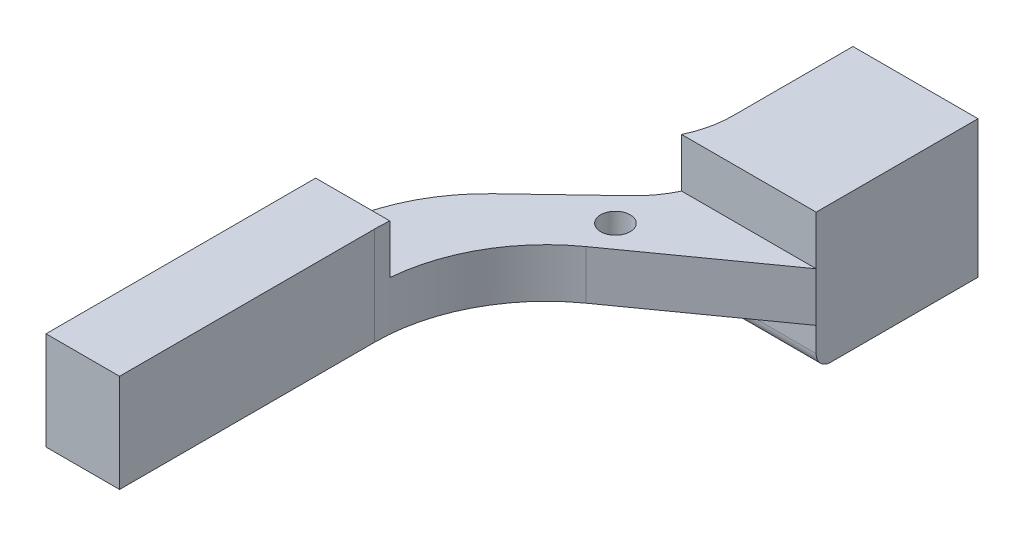
ISO-10303-21;
HEADER;
FILE_DESCRIPTION(('STEP AP214'),'2;1');
FILE_NAME('part.step','',(''),(''),'','','');
FILE_SCHEMA(('AUTOMOTIVE_DESIGN { 1 0 10303 214 1 1 1 1 }'));
ENDSEC;
DATA;
#1=APPLICATION_CONTEXT('core data for automotive mechanical design processes');
#2=APPLICATION_PROTOCOL_DEFINITION('international standard','automotive_design',2000,#1);
#3=PRODUCT_CONTEXT('',#1,'mechanical');
#4=PRODUCT('Part','Part','',(#3));
#5=PRODUCT_RELATED_PRODUCT_CATEGORY('part','',(#4));
#6=PRODUCT_DEFINITION_FORMATION('','',#4);
#7=PRODUCT_DEFINITION_CONTEXT('part definition',#1,'design');
#8=PRODUCT_DEFINITION('design','',#6,#7);
#9=PRODUCT_DEFINITION_SHAPE('','',#8);
#10=(LENGTH_UNIT() NAMED_UNIT(*) SI_UNIT(.MILLI.,.METRE.));
#11=(NAMED_UNIT(*) PLANE_ANGLE_UNIT() SI_UNIT($,.RADIAN.));
#12=(NAMED_UNIT(*) SI_UNIT($,.STERADIAN.) SOLID_ANGLE_UNIT());
#13=UNCERTAINTY_MEASURE_WITH_UNIT(LENGTH_MEASURE(1.E-05),#10,'distance_accuracy_value','');
#14=(GEOMETRIC_REPRESENTATION_CONTEXT(3) GLOBAL_UNCERTAINTY_ASSIGNED_CONTEXT((#13)) GLOBAL_UNIT_ASSIGNED_CONTEXT((#10,
#11,#12)) REPRESENTATION_CONTEXT('',''));
#15=CARTESIAN_POINT('',(0.,0.,0.));
#16=DIRECTION('',(0.,0.,1.));
#17=DIRECTION('',(1.,0.,0.));
#18=AXIS2_PLACEMENT_3D('',#15,#16,#17);
#19=CARTESIAN_POINT('',(97.8191059886915,14.,30.));
#20=DIRECTION('',(0.,-1.,0.));
#21=DIRECTION('',(0.,0.,-1.));
#22=AXIS2_PLACEMENT_3D('',#19,#20,#21);
#23=PLANE('',#22);
#24=CARTESIAN_POINT('',(90.7845529943458,14.,81.0202352893997));
#25=DIRECTION('',(0.,1.,0.));
#26=DIRECTION('',(0.,0.,-1.));
#27=AXIS2_PLACEMENT_3D('',#24,#25,#26);
#28=CIRCLE('',#27,35.);
#29=CARTESIAN_POINT('',(55.914127663777,14.,78.0113422595251));
#30=VERTEX_POINT('',#29);
#31=CARTESIAN_POINT('',(55.7845529943458,14.,81.0202352893997));
#32=VERTEX_POINT('',#31);
#33=EDGE_CURVE('E309',#30,#32,#28,.T.);
#34=ORIENTED_EDGE('',*,*,#33,.F.);
#35=DIRECTION('',(1.,0.,0.));
#36=VECTOR('',#35,1.);
#37=CARTESIAN_POINT('',(97.8191059886915,14.,78.0113422595251));
#38=LINE('',#37,#36);
#39=CARTESIAN_POINT('',(40.7845529943458,14.,78.0113422595251));
#40=VERTEX_POINT('',#39);
#41=EDGE_CURVE('E200',#40,#30,#38,.T.);
#42=ORIENTED_EDGE('',*,*,#41,.F.);
#43=DIRECTION('',(0.,0.,-1.));
#44=VECTOR('',#43,1.);
#45=CARTESIAN_POINT('',(40.7845529943458,14.,133.));
#46=LINE('',#45,#44);
#47=CARTESIAN_POINT('',(40.7845529943458,14.,133.));
#48=VERTEX_POINT('',#47);
#49=EDGE_CURVE('E243',#48,#40,#46,.T.);
#50=ORIENTED_EDGE('',*,*,#49,.F.);
#51=DIRECTION('',(-1.,0.,0.));
#52=VECTOR('',#51,1.);
#53=CARTESIAN_POINT('',(55.7845529943458,14.,133.));
#54=LINE('',#53,#52);
#55=CARTESIAN_POINT('',(55.7845529943458,14.,133.));
#56=VERTEX_POINT('',#55);
#57=EDGE_CURVE('E248',#56,#48,#54,.T.);
#58=ORIENTED_EDGE('',*,*,#57,.F.);
#59=DIRECTION('',(0.,0.,1.));
#60=VECTOR('',#59,1.);
#61=CARTESIAN_POINT('',(55.7845529943458,14.,63.));
#62=LINE('',#61,#60);
#63=EDGE_CURVE('E252',#32,#56,#62,.T.);
#64=ORIENTED_EDGE('',*,*,#63,.F.);
#65=EDGE_LOOP('',(#34,#42,#50,#58,#64));
#66=FACE_BOUND('',#65,.T.);
#67=ADVANCED_FACE('F38',(#66),#23,.F.);
#68=CARTESIAN_POINT('',(81.5691059886915,0.,0.));
#69=DIRECTION('',(0.,0.,-1.));
#70=DIRECTION('',(1.,0.,0.));
#71=AXIS2_PLACEMENT_3D('',#68,#69,#70);
#72=PLANE('',#71);
#73=DIRECTION('',(0.,1.,0.));
#74=VECTOR('',#73,1.);
#75=CARTESIAN_POINT('',(72.3191059886915,-14.,0.));
#76=LINE('',#75,#74);
#77=CARTESIAN_POINT('',(72.3191059886915,-14.,0.));
#78=VERTEX_POINT('',#77);
#79=CARTESIAN_POINT('',(72.3191059886915,14.,0.));
#80=VERTEX_POINT('',#79);
#81=EDGE_CURVE('E413',#78,#80,#76,.T.);
#82=ORIENTED_EDGE('',*,*,#81,.T.);
#83=DIRECTION('',(1.,0.,0.));
#84=VECTOR('',#83,1.);
#85=CARTESIAN_POINT('',(97.8191059886915,14.,0.));
#86=LINE('',#85,#84);
#87=CARTESIAN_POINT('',(97.8191059886915,14.,0.));
#88=VERTEX_POINT('',#87);
#89=EDGE_CURVE('E349',#80,#88,#86,.T.);
#90=ORIENTED_EDGE('',*,*,#89,.T.);
#91=DIRECTION('',(0.,-1.,0.));
#92=VECTOR('',#91,1.);
#93=CARTESIAN_POINT('',(97.8191059886915,-14.,0.));
#94=LINE('',#93,#92);
#95=CARTESIAN_POINT('',(97.8191059886915,-14.,0.));
#96=VERTEX_POINT('',#95);
#97=EDGE_CURVE('E408',#88,#96,#94,.T.);
#98=ORIENTED_EDGE('',*,*,#97,.T.);
#99=DIRECTION('',(-1.,0.,0.));
#100=VECTOR('',#99,1.);
#101=CARTESIAN_POINT('',(97.8191059886915,-14.,0.));
#102=LINE('',#101,#100);
#103=EDGE_CURVE('E399',#96,#78,#102,.T.);
#104=ORIENTED_EDGE('',*,*,#103,.T.);
#105=EDGE_LOOP('',(#82,#90,#98,#104));
#106=FACE_BOUND('',#105,.T.);
#107=DIRECTION('',(-1.,0.,0.));
#108=VECTOR('',#107,1.);
#109=CARTESIAN_POINT('',(87.8191059886915,-11.3,0.));
#110=LINE('',#109,#108);
#111=CARTESIAN_POINT('',(87.8191059886915,-11.3,0.));
#112=VERTEX_POINT('',#111);
#113=CARTESIAN_POINT('',(75.3191059886915,-11.3,0.));
#114=VERTEX_POINT('',#113);
#115=EDGE_CURVE('E429',#112,#114,#110,.T.);
#116=ORIENTED_EDGE('',*,*,#115,.F.);
#117=DIRECTION('',(0.,-1.,0.));
#118=VECTOR('',#117,1.);
#119=CARTESIAN_POINT('',(87.8191059886915,-11.3,0.));
#120=LINE('',#119,#118);
#121=CARTESIAN_POINT('',(87.8191059886915,11.3,0.));
#122=VERTEX_POINT('',#121);
#123=EDGE_CURVE('E434',#122,#112,#120,.T.);
#124=ORIENTED_EDGE('',*,*,#123,.F.);
#125=DIRECTION('',(1.,0.,0.));
#126=VECTOR('',#125,1.);
#127=CARTESIAN_POINT('',(87.8191059886915,11.3,0.));
#128=LINE('',#127,#126);
#129=CARTESIAN_POINT('',(75.3191059886915,11.3,0.));
#130=VERTEX_POINT('',#129);
#131=EDGE_CURVE('E221',#130,#122,#128,.T.);
#132=ORIENTED_EDGE('',*,*,#131,.F.);
#133=DIRECTION('',(0.,1.,0.));
#134=VECTOR('',#133,1.);
#135=CARTESIAN_POINT('',(75.3191059886915,-11.3,0.));
#136=LINE('',#135,#134);
#137=EDGE_CURVE('E218',#114,#130,#136,.T.);
#138=ORIENTED_EDGE('',*,*,#137,.F.);
#139=EDGE_LOOP('',(#116,#124,#132,#138));
#140=FACE_BOUND('',#139,.T.);
#141=ADVANCED_FACE('F472',(#106,#140),#72,.T.);
#142=CARTESIAN_POINT('',(72.3191059886915,-14.,30.));
#143=DIRECTION('',(1.,0.,0.));
#144=DIRECTION('',(0.,0.,1.));
#145=AXIS2_PLACEMENT_3D('',#142,#143,#144);
#146=PLANE('',#145);
#147=DIRECTION('',(0.,0.,-1.));
#148=VECTOR('',#147,1.);
#149=CARTESIAN_POINT('',(72.3191059886915,14.,30.));
#150=LINE('',#149,#148);
#151=CARTESIAN_POINT('',(72.3191059886915,14.,24.4220901374142));
#152=VERTEX_POINT('',#151);
#153=EDGE_CURVE('E347',#152,#80,#150,.T.);
#154=ORIENTED_EDGE('',*,*,#153,.T.);
#155=ORIENTED_EDGE('',*,*,#81,.F.);
#156=DIRECTION('',(0.,0.,-1.));
#157=VECTOR('',#156,1.);
#158=CARTESIAN_POINT('',(72.3191059886915,-14.,30.));
#159=LINE('',#158,#157);
#160=CARTESIAN_POINT('',(72.3191059886915,-14.,30.));
#161=VERTEX_POINT('',#160);
#162=EDGE_CURVE('E402',#161,#78,#159,.T.);
#163=ORIENTED_EDGE('',*,*,#162,.F.);
#164=CARTESIAN_POINT('',(72.3191059886915,-11.,30.));
#165=DIRECTION('',(-1.,0.,0.));
#166=DIRECTION('',(0.,0.,1.));
#167=AXIS2_PLACEMENT_3D('',#164,#165,#166);
#168=CIRCLE('',#167,3.);
#169=CARTESIAN_POINT('',(72.3191059886915,-11.,33.));
#170=VERTEX_POINT('',#169);
#171=EDGE_CURVE('E357',#170,#161,#168,.F.);
#172=ORIENTED_EDGE('',*,*,#171,.F.);
#173=DIRECTION('',(0.,1.,0.));
#174=VECTOR('',#173,1.);
#175=CARTESIAN_POINT('',(72.3191059886915,14.,33.));
#176=LINE('',#175,#174);
#177=CARTESIAN_POINT('',(72.3191059886915,-6.,33.));
#178=VERTEX_POINT('',#177);
#179=EDGE_CURVE('E226',#170,#178,#176,.T.);
#180=ORIENTED_EDGE('',*,*,#179,.T.);
#181=DIRECTION('',(0.,0.,1.));
#182=VECTOR('',#181,1.);
#183=CARTESIAN_POINT('',(72.3191059886915,-6.,0.));
#184=LINE('',#183,#182);
#185=CARTESIAN_POINT('',(72.3191059886915,-6.,24.4220901374142));
#186=VERTEX_POINT('',#185);
#187=EDGE_CURVE('E323',#186,#178,#184,.T.);
#188=ORIENTED_EDGE('',*,*,#187,.F.);
#189=DIRECTION('',(0.,1.,0.));
#190=VECTOR('',#189,1.);
#191=CARTESIAN_POINT('',(72.3191059886915,-14.,24.4220901374142));
#192=LINE('',#191,#190);
#193=EDGE_CURVE('E326',#152,#186,#192,.F.);
#194=ORIENTED_EDGE('',*,*,#193,.F.);
#195=EDGE_LOOP('',(#154,#155,#163,#172,#180,#188,#194));
#196=FACE_BOUND('',#195,.T.);
#197=ADVANCED_FACE('F389',(#196),#146,.F.);
#198=CARTESIAN_POINT('',(52.3191059886915,14.,24.4220901374142));
#199=DIRECTION('',(0.,1.,0.));
#200=DIRECTION('',(0.,0.,-1.));
#201=AXIS2_PLACEMENT_3D('',#198,#199,#200);
#202=CIRCLE('',#201,20.);
#203=CARTESIAN_POINT('',(70.3861882763592,14.,33.));
#204=VERTEX_POINT('',#203);
#205=EDGE_CURVE('E329',#204,#152,#202,.T.);
#206=ORIENTED_EDGE('',*,*,#205,.F.);
#207=DIRECTION('',(-1.,0.,0.));
#208=VECTOR('',#207,1.);
#209=CARTESIAN_POINT('',(97.8191059886915,14.,33.));
#210=LINE('',#209,#208);
#211=CARTESIAN_POINT('',(97.8191059886915,14.,33.));
#212=VERTEX_POINT('',#211);
#213=EDGE_CURVE('E289',#212,#204,#210,.T.);
#214=ORIENTED_EDGE('',*,*,#213,.F.);
#215=DIRECTION('',(0.,0.,-1.));
#216=VECTOR('',#215,1.);
#217=CARTESIAN_POINT('',(97.8191059886915,14.,30.));
#218=LINE('',#217,#216);
#219=EDGE_CURVE('E216',#212,#88,#218,.T.);
#220=ORIENTED_EDGE('',*,*,#219,.T.);
#221=ORIENTED_EDGE('',*,*,#89,.F.);
#222=ORIENTED_EDGE('',*,*,#153,.F.);
#223=EDGE_LOOP('',(#206,#214,#220,#221,#222));
#224=FACE_BOUND('',#223,.T.);
#225=ADVANCED_FACE('F345',(#224),#23,.F.);
#226=CARTESIAN_POINT('',(97.8191059886915,-14.,30.));
#227=DIRECTION('',(-1.,0.,0.));
#228=DIRECTION('',(0.,0.,-1.));
#229=AXIS2_PLACEMENT_3D('',#226,#227,#228);
#230=PLANE('',#229);
#231=DIRECTION('',(0.,0.,-1.));
#232=VECTOR('',#231,1.);
#233=CARTESIAN_POINT('',(97.8191059886915,-14.,30.));
#234=LINE('',#233,#232);
#235=CARTESIAN_POINT('',(97.8191059886915,-14.,30.));
#236=VERTEX_POINT('',#235);
#237=EDGE_CURVE('E359',#236,#96,#234,.T.);
#238=ORIENTED_EDGE('',*,*,#237,.T.);
#239=ORIENTED_EDGE('',*,*,#97,.F.);
#240=ORIENTED_EDGE('',*,*,#219,.F.);
#241=DIRECTION('',(0.,-1.,0.));
#242=VECTOR('',#241,1.);
#243=CARTESIAN_POINT('',(97.8191059886915,14.,33.));
#244=LINE('',#243,#242);
#245=CARTESIAN_POINT('',(97.8191059886915,4.,33.));
#246=VERTEX_POINT('',#245);
#247=EDGE_CURVE('E194',#212,#246,#244,.T.);
#248=ORIENTED_EDGE('',*,*,#247,.T.);
#249=CARTESIAN_POINT('',(97.8191059886915,-6.,33.));
#250=VERTEX_POINT('',#249);
#251=EDGE_CURVE('E203',#246,#250,#244,.T.);
#252=ORIENTED_EDGE('',*,*,#251,.T.);
#253=CARTESIAN_POINT('',(97.8191059886915,-11.,33.));
#254=VERTEX_POINT('',#253);
#255=EDGE_CURVE('E211',#250,#254,#244,.T.);
#256=ORIENTED_EDGE('',*,*,#255,.T.);
#257=CARTESIAN_POINT('',(97.8191059886915,-11.,30.));
#258=DIRECTION('',(1.,0.,0.));
#259=DIRECTION('',(0.,0.,-1.));
#260=AXIS2_PLACEMENT_3D('',#257,#258,#259);
#261=CIRCLE('',#260,3.);
#262=EDGE_CURVE('E369',#236,#254,#261,.F.);
#263=ORIENTED_EDGE('',*,*,#262,.F.);
#264=EDGE_LOOP('',(#238,#239,#240,#248,#252,#256,#263));
#265=FACE_BOUND('',#264,.T.);
#266=ADVANCED_FACE('F214',(#265),#230,.F.);
#267=CARTESIAN_POINT('',(97.8191059886915,-14.,30.));
#268=DIRECTION('',(0.,1.,0.));
#269=DIRECTION('',(0.,0.,1.));
#270=AXIS2_PLACEMENT_3D('',#267,#268,#269);
#271=PLANE('',#270);
#272=ORIENTED_EDGE('',*,*,#162,.T.);
#273=ORIENTED_EDGE('',*,*,#103,.F.);
#274=ORIENTED_EDGE('',*,*,#237,.F.);
#275=DIRECTION('',(-1.,0.,0.));
#276=VECTOR('',#275,1.);
#277=CARTESIAN_POINT('',(97.8191059886915,-14.,30.));
#278=LINE('',#277,#276);
#279=EDGE_CURVE('E366',#161,#236,#278,.F.);
#280=ORIENTED_EDGE('',*,*,#279,.F.);
#281=EDGE_LOOP('',(#272,#273,#274,#280));
#282=FACE_BOUND('',#281,.T.);
#283=ADVANCED_FACE('F397',(#282),#271,.F.);
#284=CARTESIAN_POINT('',(75.3191059886915,-11.3,30.));
#285=DIRECTION('',(1.,0.,0.));
#286=DIRECTION('',(0.,0.,1.));
#287=AXIS2_PLACEMENT_3D('',#284,#285,#286);
#288=PLANE('',#287);
#289=ORIENTED_EDGE('',*,*,#137,.T.);
#290=DIRECTION('',(0.,0.,-1.));
#291=VECTOR('',#290,1.);
#292=CARTESIAN_POINT('',(75.3191059886915,11.3,30.));
#293=LINE('',#292,#291);
#294=CARTESIAN_POINT('',(75.3191059886915,11.3,30.));
#295=VERTEX_POINT('',#294);
#296=EDGE_CURVE('E416',#295,#130,#293,.T.);
#297=ORIENTED_EDGE('',*,*,#296,.F.);
#298=DIRECTION('',(0.,1.,0.));
#299=VECTOR('',#298,1.);
#300=CARTESIAN_POINT('',(75.3191059886915,-11.3,30.));
#301=LINE('',#300,#299);
#302=CARTESIAN_POINT('',(75.3191059886915,-11.3,30.));
#303=VERTEX_POINT('',#302);
#304=EDGE_CURVE('E433',#303,#295,#301,.T.);
#305=ORIENTED_EDGE('',*,*,#304,.F.);
#306=DIRECTION('',(0.,0.,-1.));
#307=VECTOR('',#306,1.);
#308=CARTESIAN_POINT('',(75.3191059886915,-11.3,30.));
#309=LINE('',#308,#307);
#310=EDGE_CURVE('E425',#303,#114,#309,.T.);
#311=ORIENTED_EDGE('',*,*,#310,.T.);
#312=EDGE_LOOP('',(#289,#297,#305,#311));
#313=FACE_BOUND('',#312,.T.);
#314=ADVANCED_FACE('F459',(#313),#288,.T.);
#315=CARTESIAN_POINT('',(87.8191059886915,11.3,30.));
#316=DIRECTION('',(0.,-1.,0.));
#317=DIRECTION('',(0.,0.,-1.));
#318=AXIS2_PLACEMENT_3D('',#315,#316,#317);
#319=PLANE('',#318);
#320=ORIENTED_EDGE('',*,*,#131,.T.);
#321=DIRECTION('',(0.,0.,-1.));
#322=VECTOR('',#321,1.);
#323=CARTESIAN_POINT('',(87.8191059886915,11.3,30.));
#324=LINE('',#323,#322);
#325=CARTESIAN_POINT('',(87.8191059886915,11.3,30.));
#326=VERTEX_POINT('',#325);
#327=EDGE_CURVE('E419',#326,#122,#324,.T.);
#328=ORIENTED_EDGE('',*,*,#327,.F.);
#329=DIRECTION('',(1.,0.,0.));
#330=VECTOR('',#329,1.);
#331=CARTESIAN_POINT('',(87.8191059886915,11.3,30.));
#332=LINE('',#331,#330);
#333=EDGE_CURVE('E447',#295,#326,#332,.T.);
#334=ORIENTED_EDGE('',*,*,#333,.F.);
#335=ORIENTED_EDGE('',*,*,#296,.T.);
#336=EDGE_LOOP('',(#320,#328,#334,#335));
#337=FACE_BOUND('',#336,.T.);
#338=ADVANCED_FACE('F463',(#337),#319,.T.);
#339=CARTESIAN_POINT('',(87.8191059886915,-11.3,30.));
#340=DIRECTION('',(-1.,0.,0.));
#341=DIRECTION('',(0.,0.,-1.));
#342=AXIS2_PLACEMENT_3D('',#339,#340,#341);
#343=PLANE('',#342);
#344=ORIENTED_EDGE('',*,*,#123,.T.);
#345=DIRECTION('',(0.,0.,-1.));
#346=VECTOR('',#345,1.);
#347=CARTESIAN_POINT('',(87.8191059886915,-11.3,30.));
#348=LINE('',#347,#346);
#349=CARTESIAN_POINT('',(87.8191059886915,-11.3,30.));
#350=VERTEX_POINT('',#349);
#351=EDGE_CURVE('E422',#350,#112,#348,.T.);
#352=ORIENTED_EDGE('',*,*,#351,.F.);
#353=DIRECTION('',(0.,-1.,0.));
#354=VECTOR('',#353,1.);
#355=CARTESIAN_POINT('',(87.8191059886915,-11.3,30.));
#356=LINE('',#355,#354);
#357=EDGE_CURVE('E443',#326,#350,#356,.T.);
#358=ORIENTED_EDGE('',*,*,#357,.F.);
#359=ORIENTED_EDGE('',*,*,#327,.T.);
#360=EDGE_LOOP('',(#344,#352,#358,#359));
#361=FACE_BOUND('',#360,.T.);
#362=ADVANCED_FACE('F466',(#361),#343,.T.);
#363=CARTESIAN_POINT('',(87.8191059886915,-11.3,30.));
#364=DIRECTION('',(0.,1.,0.));
#365=DIRECTION('',(0.,0.,1.));
#366=AXIS2_PLACEMENT_3D('',#363,#364,#365);
#367=PLANE('',#366);
#368=ORIENTED_EDGE('',*,*,#115,.T.);
#369=ORIENTED_EDGE('',*,*,#310,.F.);
#370=DIRECTION('',(-1.,0.,0.));
#371=VECTOR('',#370,1.);
#372=CARTESIAN_POINT('',(87.8191059886915,-11.3,30.));
#373=LINE('',#372,#371);
#374=EDGE_CURVE('E428',#350,#303,#373,.T.);
#375=ORIENTED_EDGE('',*,*,#374,.F.);
#376=ORIENTED_EDGE('',*,*,#351,.T.);
#377=EDGE_LOOP('',(#368,#369,#375,#376));
#378=FACE_BOUND('',#377,.T.);
#379=ADVANCED_FACE('F470',(#378),#367,.T.);
#380=CARTESIAN_POINT('',(81.5691059886915,0.,30.));
#381=DIRECTION('',(0.,0.,-1.));
#382=DIRECTION('',(1.,0.,0.));
#383=AXIS2_PLACEMENT_3D('',#380,#381,#382);
#384=PLANE('',#383);
#385=ORIENTED_EDGE('',*,*,#304,.T.);
#386=ORIENTED_EDGE('',*,*,#333,.T.);
#387=ORIENTED_EDGE('',*,*,#357,.T.);
#388=ORIENTED_EDGE('',*,*,#374,.T.);
#389=EDGE_LOOP('',(#385,#386,#387,#388));
#390=FACE_BOUND('',#389,.T.);
#391=ADVANCED_FACE('F455',(#390),#384,.T.);
#392=CARTESIAN_POINT('',(81.5691059886915,0.,33.));
#393=DIRECTION('',(0.,0.,-1.));
#394=DIRECTION('',(1.,0.,0.));
#395=AXIS2_PLACEMENT_3D('',#392,#393,#394);
#396=PLANE('',#395);
#397=ORIENTED_EDGE('',*,*,#255,.F.);
#398=DIRECTION('',(1.,0.,0.));
#399=VECTOR('',#398,1.);
#400=CARTESIAN_POINT('',(72.3191059886915,-6.,33.));
#401=LINE('',#400,#399);
#402=EDGE_CURVE('E247',#178,#250,#401,.T.);
#403=ORIENTED_EDGE('',*,*,#402,.F.);
#404=ORIENTED_EDGE('',*,*,#179,.F.);
#405=DIRECTION('',(-1.,0.,0.));
#406=VECTOR('',#405,1.);
#407=CARTESIAN_POINT('',(81.5691059886915,-11.,33.));
#408=LINE('',#407,#406);
#409=EDGE_CURVE('E353',#254,#170,#408,.T.);
#410=ORIENTED_EDGE('',*,*,#409,.F.);
#411=EDGE_LOOP('',(#397,#403,#404,#410));
#412=FACE_BOUND('',#411,.T.);
#413=ADVANCED_FACE('F391',(#412),#396,.F.);
#414=CARTESIAN_POINT('',(72.3191059886915,-6.,33.));
#415=DIRECTION('',(-0.689258608548899,0.,-0.724515403936476));
#416=DIRECTION('',(0.724515403936476,0.,-0.689258608548899));
#417=AXIS2_PLACEMENT_3D('',#414,#415,#416);
#418=PLANE('',#417);
#419=DIRECTION('',(-0.724515403936476,0.,0.689258608548899));
#420=VECTOR('',#419,1.);
#421=CARTESIAN_POINT('',(72.3191059886915,4.,33.));
#422=LINE('',#421,#420);
#423=CARTESIAN_POINT('',(66.1042781596695,4.,38.9123982161438));
#424=VERTEX_POINT('',#423);
#425=CARTESIAN_POINT('',(51.6605016951343,4.,52.6533031217485));
#426=VERTEX_POINT('',#425);
#427=EDGE_CURVE('E277',#424,#426,#422,.T.);
#428=ORIENTED_EDGE('',*,*,#427,.F.);
#429=DIRECTION('',(0.,1.,0.));
#430=VECTOR('',#429,1.);
#431=CARTESIAN_POINT('',(66.1042781596695,-6.,38.9123982161438));
#432=LINE('',#431,#430);
#433=CARTESIAN_POINT('',(66.1042781596695,-6.,38.9123982161438));
#434=VERTEX_POINT('',#433);
#435=EDGE_CURVE('E319',#434,#424,#432,.T.);
#436=ORIENTED_EDGE('',*,*,#435,.F.);
#437=DIRECTION('',(0.724515403936476,0.,-0.689258608548899));
#438=VECTOR('',#437,1.);
#439=CARTESIAN_POINT('',(72.3191059886915,-6.,33.));
#440=LINE('',#439,#438);
#441=CARTESIAN_POINT('',(51.6605016951343,-6.,52.6533031217484));
#442=VERTEX_POINT('',#441);
#443=EDGE_CURVE('E241',#442,#434,#440,.T.);
#444=ORIENTED_EDGE('',*,*,#443,.F.);
#445=DIRECTION('',(0.,1.,0.));
#446=VECTOR('',#445,1.);
#447=CARTESIAN_POINT('',(51.6605016951343,-6.,52.6533031217484));
#448=LINE('',#447,#446);
#449=EDGE_CURVE('E311',#426,#442,#448,.F.);
#450=ORIENTED_EDGE('',*,*,#449,.F.);
#451=EDGE_LOOP('',(#428,#436,#444,#450));
#452=FACE_BOUND('',#451,.T.);
#453=ADVANCED_FACE('F388',(#452),#418,.T.);
#454=CARTESIAN_POINT('',(40.7845529943458,-6.,133.));
#455=DIRECTION('',(-1.,0.,0.));
#456=DIRECTION('',(0.,0.,-1.));
#457=AXIS2_PLACEMENT_3D('',#454,#455,#456);
#458=PLANE('',#457);
#459=DIRECTION('',(0.,0.,-1.));
#460=VECTOR('',#459,1.);
#461=CARTESIAN_POINT('',(40.7845529943458,-6.,133.));
#462=LINE('',#461,#460);
#463=CARTESIAN_POINT('',(40.7845529943458,-6.,133.));
#464=VERTEX_POINT('',#463);
#465=CARTESIAN_POINT('',(40.7845529943458,-6.,78.0113422595251));
#466=VERTEX_POINT('',#465);
#467=EDGE_CURVE('E258',#464,#466,#462,.T.);
#468=ORIENTED_EDGE('',*,*,#467,.F.);
#469=DIRECTION('',(0.,1.,0.));
#470=VECTOR('',#469,1.);
#471=CARTESIAN_POINT('',(40.7845529943458,-6.,133.));
#472=LINE('',#471,#470);
#473=EDGE_CURVE('E231',#464,#48,#472,.T.);
#474=ORIENTED_EDGE('',*,*,#473,.T.);
#475=ORIENTED_EDGE('',*,*,#49,.T.);
#476=DIRECTION('',(0.,1.,0.));
#477=VECTOR('',#476,1.);
#478=CARTESIAN_POINT('',(40.7845529943458,4.,78.0113422595251));
#479=LINE('',#478,#477);
#480=CARTESIAN_POINT('',(40.7845529943458,4.,78.0113422595251));
#481=VERTEX_POINT('',#480);
#482=EDGE_CURVE('E284',#481,#40,#479,.T.);
#483=ORIENTED_EDGE('',*,*,#482,.F.);
#484=DIRECTION('',(0.,1.,0.));
#485=VECTOR('',#484,1.);
#486=CARTESIAN_POINT('',(40.7845529943458,-6.,78.0113422595251));
#487=LINE('',#486,#485);
#488=EDGE_CURVE('E373',#466,#481,#487,.T.);
#489=ORIENTED_EDGE('',*,*,#488,.F.);
#490=EDGE_LOOP('',(#468,#474,#475,#483,#489));
#491=FACE_BOUND('',#490,.T.);
#492=ADVANCED_FACE('F518',(#491),#458,.T.);
#493=CARTESIAN_POINT('',(55.7845529943458,-6.,133.));
#494=DIRECTION('',(0.,0.,1.));
#495=DIRECTION('',(-1.,0.,0.));
#496=AXIS2_PLACEMENT_3D('',#493,#494,#495);
#497=PLANE('',#496);
#498=ORIENTED_EDGE('',*,*,#57,.T.);
#499=ORIENTED_EDGE('',*,*,#473,.F.);
#500=DIRECTION('',(-1.,0.,0.));
#501=VECTOR('',#500,1.);
#502=CARTESIAN_POINT('',(55.7845529943458,-6.,133.));
#503=LINE('',#502,#501);
#504=CARTESIAN_POINT('',(55.7845529943458,-6.,133.));
#505=VERTEX_POINT('',#504);
#506=EDGE_CURVE('E262',#505,#464,#503,.T.);
#507=ORIENTED_EDGE('',*,*,#506,.F.);
#508=DIRECTION('',(0.,1.,0.));
#509=VECTOR('',#508,1.);
#510=CARTESIAN_POINT('',(55.7845529943458,-6.,133.));
#511=LINE('',#510,#509);
#512=EDGE_CURVE('E237',#505,#56,#511,.T.);
#513=ORIENTED_EDGE('',*,*,#512,.T.);
#514=EDGE_LOOP('',(#498,#499,#507,#513));
#515=FACE_BOUND('',#514,.T.);
#516=ADVANCED_FACE('F521',(#515),#497,.T.);
#517=CARTESIAN_POINT('',(55.7845529943458,-6.,63.));
#518=DIRECTION('',(1.,0.,0.));
#519=DIRECTION('',(0.,0.,1.));
#520=AXIS2_PLACEMENT_3D('',#517,#518,#519);
#521=PLANE('',#520);
#522=ORIENTED_EDGE('',*,*,#63,.T.);
#523=ORIENTED_EDGE('',*,*,#512,.F.);
#524=DIRECTION('',(0.,0.,1.));
#525=VECTOR('',#524,1.);
#526=CARTESIAN_POINT('',(55.7845529943458,-6.,63.));
#527=LINE('',#526,#525);
#528=CARTESIAN_POINT('',(55.7845529943458,-6.,81.0202352893997));
#529=VERTEX_POINT('',#528);
#530=EDGE_CURVE('E265',#529,#505,#527,.T.);
#531=ORIENTED_EDGE('',*,*,#530,.F.);
#532=DIRECTION('',(0.,1.,0.));
#533=VECTOR('',#532,1.);
#534=CARTESIAN_POINT('',(55.7845529943458,-6.,81.0202352893997));
#535=LINE('',#534,#533);
#536=EDGE_CURVE('E304',#32,#529,#535,.F.);
#537=ORIENTED_EDGE('',*,*,#536,.F.);
#538=EDGE_LOOP('',(#522,#523,#531,#537));
#539=FACE_BOUND('',#538,.T.);
#540=ADVANCED_FACE('F525',(#539),#521,.T.);
#541=CARTESIAN_POINT('',(97.8191059886915,-6.,33.));
#542=DIRECTION('',(0.580921690109622,0.,0.813959452282594));
#543=DIRECTION('',(-0.813959452282594,0.,0.580921690109622));
#544=AXIS2_PLACEMENT_3D('',#541,#542,#543);
#545=PLANE('',#544);
#546=DIRECTION('',(0.813959452282594,0.,-0.580921690109622));
#547=VECTOR('',#546,1.);
#548=CARTESIAN_POINT('',(97.8191059886915,4.,33.));
#549=LINE('',#548,#547);
#550=CARTESIAN_POINT('',(70.452293840509,4.,52.5316544595089));
#551=VERTEX_POINT('',#550);
#552=EDGE_CURVE('E178',#551,#246,#549,.T.);
#553=ORIENTED_EDGE('',*,*,#552,.F.);
#554=DIRECTION('',(0.,1.,0.));
#555=VECTOR('',#554,1.);
#556=CARTESIAN_POINT('',(70.452293840509,14.,52.5316544595089));
#557=LINE('',#556,#555);
#558=CARTESIAN_POINT('',(70.452293840509,-6.,52.5316544595089));
#559=VERTEX_POINT('',#558);
#560=EDGE_CURVE('E300',#559,#551,#557,.T.);
#561=ORIENTED_EDGE('',*,*,#560,.F.);
#562=DIRECTION('',(-0.813959452282594,0.,0.580921690109622));
#563=VECTOR('',#562,1.);
#564=CARTESIAN_POINT('',(97.8191059886915,-6.,33.));
#565=LINE('',#564,#563);
#566=EDGE_CURVE('E206',#250,#559,#565,.T.);
#567=ORIENTED_EDGE('',*,*,#566,.F.);
#568=ORIENTED_EDGE('',*,*,#251,.F.);
#569=EDGE_LOOP('',(#553,#561,#567,#568));
#570=FACE_BOUND('',#569,.T.);
#571=ADVANCED_FACE('F204',(#570),#545,.T.);
#572=CARTESIAN_POINT('',(81.5691059886915,-6.,0.));
#573=DIRECTION('',(0.,1.,0.));
#574=DIRECTION('',(0.,0.,1.));
#575=AXIS2_PLACEMENT_3D('',#572,#573,#574);
#576=PLANE('',#575);
#577=CARTESIAN_POINT('',(69.3191059886915,-6.,45.4260665059655));
#578=DIRECTION('',(0.,-1.,0.));
#579=DIRECTION('',(0.,0.,1.));
#580=AXIS2_PLACEMENT_3D('',#577,#578,#579);
#581=CIRCLE('',#580,3.);
#582=CARTESIAN_POINT('',(69.3191059886915,-6.,48.4260665059655));
#583=VERTEX_POINT('',#582);
#584=EDGE_CURVE('E189',#583,#583,#581,.T.);
#585=ORIENTED_EDGE('',*,*,#584,.F.);
#586=EDGE_LOOP('',(#585));
#587=FACE_BOUND('',#586,.T.);
#588=ORIENTED_EDGE('',*,*,#443,.T.);
#589=CARTESIAN_POINT('',(52.3191059886915,-6.,24.4220901374142));
#590=DIRECTION('',(0.,-1.,0.));
#591=DIRECTION('',(0.,0.,1.));
#592=AXIS2_PLACEMENT_3D('',#589,#590,#591);
#593=CIRCLE('',#592,20.);
#594=EDGE_CURVE('E62',#186,#434,#593,.T.);
#595=ORIENTED_EDGE('',*,*,#594,.F.);
#596=ORIENTED_EDGE('',*,*,#187,.T.);
#597=ORIENTED_EDGE('',*,*,#402,.T.);
#598=ORIENTED_EDGE('',*,*,#566,.T.);
#599=CARTESIAN_POINT('',(90.7845529943458,-6.,81.0202352893997));
#600=DIRECTION('',(0.,-1.,0.));
#601=DIRECTION('',(0.,0.,1.));
#602=AXIS2_PLACEMENT_3D('',#599,#600,#601);
#603=CIRCLE('',#602,35.);
#604=EDGE_CURVE('E302',#529,#559,#603,.T.);
#605=ORIENTED_EDGE('',*,*,#604,.F.);
#606=ORIENTED_EDGE('',*,*,#530,.T.);
#607=ORIENTED_EDGE('',*,*,#506,.T.);
#608=ORIENTED_EDGE('',*,*,#467,.T.);
#609=CARTESIAN_POINT('',(75.7845529943458,-6.,78.0113422595251));
#610=DIRECTION('',(0.,-1.,0.));
#611=DIRECTION('',(0.,0.,1.));
#612=AXIS2_PLACEMENT_3D('',#609,#610,#611);
#613=CIRCLE('',#612,35.);
#614=EDGE_CURVE('E305',#442,#466,#613,.F.);
#615=ORIENTED_EDGE('',*,*,#614,.F.);
#616=EDGE_LOOP('',(#588,#595,#596,#597,#598,#605,#606,#607,#608,#615));
#617=FACE_BOUND('',#616,.T.);
#618=ADVANCED_FACE('F385',(#587,#617),#576,.F.);
#619=CARTESIAN_POINT('',(81.5691059886915,-11.,30.));
#620=DIRECTION('',(-1.,0.,0.));
#621=DIRECTION('',(0.,0.,-1.));
#622=AXIS2_PLACEMENT_3D('',#619,#620,#621);
#623=CYLINDRICAL_SURFACE('',#622,3.);
#624=ORIENTED_EDGE('',*,*,#262,.T.);
#625=ORIENTED_EDGE('',*,*,#409,.T.);
#626=ORIENTED_EDGE('',*,*,#171,.T.);
#627=ORIENTED_EDGE('',*,*,#279,.T.);
#628=EDGE_LOOP('',(#624,#625,#626,#627));
#629=FACE_BOUND('',#628,.T.);
#630=ADVANCED_FACE('F393',(#629),#623,.T.);
#631=CARTESIAN_POINT('',(75.7845529943458,-6.,78.0113422595251));
#632=DIRECTION('',(0.,1.,0.));
#633=DIRECTION('',(0.,0.,1.));
#634=AXIS2_PLACEMENT_3D('',#631,#632,#633);
#635=CYLINDRICAL_SURFACE('',#634,35.);
#636=CARTESIAN_POINT('',(75.7845529943458,4.,78.0113422595251));
#637=DIRECTION('',(0.,-1.,0.));
#638=DIRECTION('',(0.,0.,-1.));
#639=AXIS2_PLACEMENT_3D('',#636,#637,#638);
#640=CIRCLE('',#639,35.);
#641=EDGE_CURVE('E274',#426,#481,#640,.F.);
#642=ORIENTED_EDGE('',*,*,#641,.F.);
#643=ORIENTED_EDGE('',*,*,#449,.T.);
#644=ORIENTED_EDGE('',*,*,#614,.T.);
#645=ORIENTED_EDGE('',*,*,#488,.T.);
#646=EDGE_LOOP('',(#642,#643,#644,#645));
#647=FACE_BOUND('',#646,.T.);
#648=ADVANCED_FACE('F380',(#647),#635,.T.);
#649=CARTESIAN_POINT('',(90.7845529943458,-6.,81.0202352893997));
#650=DIRECTION('',(0.,-1.,0.));
#651=DIRECTION('',(0.,0.,-1.));
#652=AXIS2_PLACEMENT_3D('',#649,#650,#651);
#653=CYLINDRICAL_SURFACE('',#652,35.);
#654=CARTESIAN_POINT('',(90.7845529943458,4.,81.0202352893997));
#655=DIRECTION('',(0.,-1.,0.));
#656=DIRECTION('',(0.,0.,-1.));
#657=AXIS2_PLACEMENT_3D('',#654,#655,#656);
#658=CIRCLE('',#657,35.);
#659=CARTESIAN_POINT('',(55.914127663777,4.,78.0113422595251));
#660=VERTEX_POINT('',#659);
#661=EDGE_CURVE('E183',#551,#660,#658,.F.);
#662=ORIENTED_EDGE('',*,*,#661,.T.);
#663=DIRECTION('',(0.,-1.,0.));
#664=VECTOR('',#663,1.);
#665=CARTESIAN_POINT('',(55.914127663777,-6.,78.0113422595251));
#666=LINE('',#665,#664);
#667=EDGE_CURVE('E11',#660,#30,#666,.F.);
#668=ORIENTED_EDGE('',*,*,#667,.T.);
#669=ORIENTED_EDGE('',*,*,#33,.T.);
#670=ORIENTED_EDGE('',*,*,#536,.T.);
#671=ORIENTED_EDGE('',*,*,#604,.T.);
#672=ORIENTED_EDGE('',*,*,#560,.T.);
#673=EDGE_LOOP('',(#662,#668,#669,#670,#671,#672));
#674=FACE_BOUND('',#673,.T.);
#675=ADVANCED_FACE('F298',(#674),#653,.F.);
#676=CARTESIAN_POINT('',(52.3191059886915,-6.,24.4220901374142));
#677=DIRECTION('',(0.,1.,0.));
#678=DIRECTION('',(0.,0.,1.));
#679=AXIS2_PLACEMENT_3D('',#676,#677,#678);
#680=CYLINDRICAL_SURFACE('',#679,20.);
#681=CARTESIAN_POINT('',(52.3191059886915,4.,24.4220901374142));
#682=DIRECTION('',(0.,-1.,0.));
#683=DIRECTION('',(0.,0.,-1.));
#684=AXIS2_PLACEMENT_3D('',#681,#682,#683);
#685=CIRCLE('',#684,20.);
#686=CARTESIAN_POINT('',(70.3861882763592,4.,33.));
#687=VERTEX_POINT('',#686);
#688=EDGE_CURVE('E280',#424,#687,#685,.F.);
#689=ORIENTED_EDGE('',*,*,#688,.T.);
#690=DIRECTION('',(0.,1.,0.));
#691=VECTOR('',#690,1.);
#692=CARTESIAN_POINT('',(70.3861882763592,-6.,33.));
#693=LINE('',#692,#691);
#694=EDGE_CURVE('E47',#687,#204,#693,.T.);
#695=ORIENTED_EDGE('',*,*,#694,.T.);
#696=ORIENTED_EDGE('',*,*,#205,.T.);
#697=ORIENTED_EDGE('',*,*,#193,.T.);
#698=ORIENTED_EDGE('',*,*,#594,.T.);
#699=ORIENTED_EDGE('',*,*,#435,.T.);
#700=EDGE_LOOP('',(#689,#695,#696,#697,#698,#699));
#701=FACE_BOUND('',#700,.T.);
#702=ADVANCED_FACE('F40',(#701),#680,.F.);
#703=CARTESIAN_POINT('',(69.3191059886915,-16.,45.4260665059655));
#704=DIRECTION('',(0.,1.,0.));
#705=DIRECTION('',(0.,0.,1.));
#706=AXIS2_PLACEMENT_3D('',#703,#704,#705);
#707=CYLINDRICAL_SURFACE('',#706,3.);
#708=CARTESIAN_POINT('',(69.3191059886915,4.,45.4260665059655));
#709=DIRECTION('',(0.,-1.,0.));
#710=DIRECTION('',(0.,0.,-1.));
#711=AXIS2_PLACEMENT_3D('',#708,#709,#710);
#712=CIRCLE('',#711,3.);
#713=CARTESIAN_POINT('',(69.3191059886915,4.,42.4260665059655));
#714=VERTEX_POINT('',#713);
#715=EDGE_CURVE('E283',#714,#714,#712,.F.);
#716=ORIENTED_EDGE('',*,*,#715,.T.);
#717=EDGE_LOOP('',(#716));
#718=FACE_BOUND('',#717,.T.);
#719=ORIENTED_EDGE('',*,*,#584,.T.);
#720=EDGE_LOOP('',(#719));
#721=FACE_BOUND('',#720,.T.);
#722=ADVANCED_FACE('F498',(#718,#721),#707,.F.);
#723=CARTESIAN_POINT('',(97.8191059886915,4.,78.0113422595251));
#724=DIRECTION('',(0.,0.,1.));
#725=DIRECTION('',(1.,0.,0.));
#726=AXIS2_PLACEMENT_3D('',#723,#724,#725);
#727=PLANE('',#726);
#728=DIRECTION('',(1.,0.,0.));
#729=VECTOR('',#728,1.);
#730=CARTESIAN_POINT('',(97.8191059886915,4.,78.0113422595251));
#731=LINE('',#730,#729);
#732=EDGE_CURVE('E199',#481,#660,#731,.T.);
#733=ORIENTED_EDGE('',*,*,#732,.F.);
#734=ORIENTED_EDGE('',*,*,#482,.T.);
#735=ORIENTED_EDGE('',*,*,#41,.T.);
#736=ORIENTED_EDGE('',*,*,#667,.F.);
#737=EDGE_LOOP('',(#733,#734,#735,#736));
#738=FACE_BOUND('',#737,.T.);
#739=ADVANCED_FACE('F502',(#738),#727,.F.);
#740=CARTESIAN_POINT('',(97.8191059886915,4.,33.));
#741=DIRECTION('',(0.,0.,-1.));
#742=DIRECTION('',(-1.,0.,0.));
#743=AXIS2_PLACEMENT_3D('',#740,#741,#742);
#744=PLANE('',#743);
#745=DIRECTION('',(-1.,0.,0.));
#746=VECTOR('',#745,1.);
#747=CARTESIAN_POINT('',(97.8191059886915,4.,33.));
#748=LINE('',#747,#746);
#749=EDGE_CURVE('E54',#246,#687,#748,.T.);
#750=ORIENTED_EDGE('',*,*,#749,.F.);
#751=ORIENTED_EDGE('',*,*,#247,.F.);
#752=ORIENTED_EDGE('',*,*,#213,.T.);
#753=ORIENTED_EDGE('',*,*,#694,.F.);
#754=EDGE_LOOP('',(#750,#751,#752,#753));
#755=FACE_BOUND('',#754,.T.);
#756=ADVANCED_FACE('F192',(#755),#744,.F.);
#757=CARTESIAN_POINT('',(0.,4.,0.));
#758=DIRECTION('',(0.,-1.,0.));
#759=DIRECTION('',(0.,0.,-1.));
#760=AXIS2_PLACEMENT_3D('',#757,#758,#759);
#761=PLANE('',#760);
#762=ORIENTED_EDGE('',*,*,#552,.T.);
#763=ORIENTED_EDGE('',*,*,#749,.T.);
#764=ORIENTED_EDGE('',*,*,#688,.F.);
#765=ORIENTED_EDGE('',*,*,#427,.T.);
#766=ORIENTED_EDGE('',*,*,#641,.T.);
#767=ORIENTED_EDGE('',*,*,#732,.T.);
#768=ORIENTED_EDGE('',*,*,#661,.F.);
#769=EDGE_LOOP('',(#762,#763,#764,#765,#766,#767,#768));
#770=FACE_BOUND('',#769,.T.);
#771=ORIENTED_EDGE('',*,*,#715,.F.);
#772=EDGE_LOOP('',(#771));
#773=FACE_BOUND('',#772,.T.);
#774=ADVANCED_FACE('F179',(#770,#773),#761,.F.);
#775=CLOSED_SHELL('',(#67,#141,#197,#225,#266,#283,#314,#338,#362,#379,#391,#413,#453,#492,#516,
#540,#571,#618,#630,#648,#675,#702,#722,#739,#756,#774));
#776=MANIFOLD_SOLID_BREP('B2',#775);
#777=ADVANCED_BREP_SHAPE_REPRESENTATION('',(#18,#776),#14);
#778=SHAPE_DEFINITION_REPRESENTATION(#9,#777);
ENDSEC;
END-ISO-10303-21;
